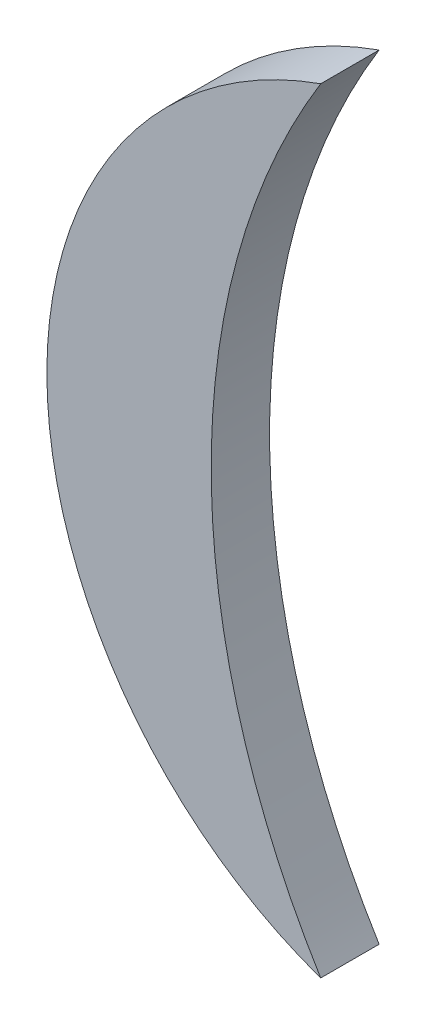
ISO-10303-21;
HEADER;
FILE_DESCRIPTION(('STEP AP214'),'2;1');
FILE_NAME('part.step','',(''),(''),'','','');
FILE_SCHEMA(('AUTOMOTIVE_DESIGN { 1 0 10303 214 1 1 1 1 }'));
ENDSEC;
DATA;
#1=APPLICATION_CONTEXT('core data for automotive mechanical design processes');
#2=APPLICATION_PROTOCOL_DEFINITION('international standard','automotive_design',2000,#1);
#3=PRODUCT_CONTEXT('',#1,'mechanical');
#4=PRODUCT('Part','Part','',(#3));
#5=PRODUCT_RELATED_PRODUCT_CATEGORY('part','',(#4));
#6=PRODUCT_DEFINITION_FORMATION('','',#4);
#7=PRODUCT_DEFINITION_CONTEXT('part definition',#1,'design');
#8=PRODUCT_DEFINITION('design','',#6,#7);
#9=PRODUCT_DEFINITION_SHAPE('','',#8);
#10=(LENGTH_UNIT() NAMED_UNIT(*) SI_UNIT(.MILLI.,.METRE.));
#11=(NAMED_UNIT(*) PLANE_ANGLE_UNIT() SI_UNIT($,.RADIAN.));
#12=(NAMED_UNIT(*) SI_UNIT($,.STERADIAN.) SOLID_ANGLE_UNIT());
#13=UNCERTAINTY_MEASURE_WITH_UNIT(LENGTH_MEASURE(1.E-05),#10,'distance_accuracy_value','');
#14=(GEOMETRIC_REPRESENTATION_CONTEXT(3) GLOBAL_UNCERTAINTY_ASSIGNED_CONTEXT((#13)) GLOBAL_UNIT_ASSIGNED_CONTEXT((#10,
#11,#12)) REPRESENTATION_CONTEXT('',''));
#15=CARTESIAN_POINT('',(0.,0.,0.));
#16=DIRECTION('',(0.,0.,1.));
#17=DIRECTION('',(1.,0.,0.));
#18=AXIS2_PLACEMENT_3D('',#15,#16,#17);
#19=CARTESIAN_POINT('',(117.2000196,54.9999916,0.));
#20=DIRECTION('',(0.,0.,-1.));
#21=DIRECTION('',(1.,0.,0.));
#22=AXIS2_PLACEMENT_3D('',#19,#20,#21);
#23=CYLINDRICAL_SURFACE('',#22,0.4499991);
#24=DIRECTION('',(0.,0.,1.));
#25=VECTOR('',#24,1.);
#26=CARTESIAN_POINT('',(116.816689855288,55.2356979784029,0.));
#27=LINE('',#26,#25);
#28=CARTESIAN_POINT('',(116.816689855288,55.2356979784029,0.));
#29=VERTEX_POINT('',#28);
#30=CARTESIAN_POINT('',(116.816689855288,55.2356979784029,0.03556));
#31=VERTEX_POINT('',#30);
#32=EDGE_CURVE('E11',#29,#31,#27,.T.);
#33=ORIENTED_EDGE('',*,*,#32,.T.);
#34=CARTESIAN_POINT('',(117.2000196,54.9999916,0.03556));
#35=DIRECTION('',(0.,0.,1.));
#36=DIRECTION('',(1.,0.,0.));
#37=AXIS2_PLACEMENT_3D('',#34,#35,#36);
#38=CIRCLE('',#37,0.4499991);
#39=CARTESIAN_POINT('',(116.816689855288,54.7642852215971,0.03556));
#40=VERTEX_POINT('',#39);
#41=EDGE_CURVE('E24',#31,#40,#38,.T.);
#42=ORIENTED_EDGE('',*,*,#41,.T.);
#43=DIRECTION('',(0.,0.,1.));
#44=VECTOR('',#43,1.);
#45=CARTESIAN_POINT('',(116.816689855288,54.7642852215971,0.));
#46=LINE('',#45,#44);
#47=CARTESIAN_POINT('',(116.816689855288,54.7642852215971,0.));
#48=VERTEX_POINT('',#47);
#49=EDGE_CURVE('E40',#48,#40,#46,.T.);
#50=ORIENTED_EDGE('',*,*,#49,.F.);
#51=CARTESIAN_POINT('',(117.2000196,54.9999916,0.));
#52=DIRECTION('',(0.,0.,1.));
#53=DIRECTION('',(1.,0.,0.));
#54=AXIS2_PLACEMENT_3D('',#51,#52,#53);
#55=CIRCLE('',#54,0.4499991);
#56=EDGE_CURVE('E42',#29,#48,#55,.T.);
#57=ORIENTED_EDGE('',*,*,#56,.F.);
#58=EDGE_LOOP('',(#33,#42,#50,#57));
#59=FACE_BOUND('',#58,.T.);
#60=ADVANCED_FACE('F17',(#59),#23,.F.);
#61=CARTESIAN_POINT('',(116.90001004,54.9999916,0.));
#62=DIRECTION('',(0.,0.,-1.));
#63=DIRECTION('',(0.,1.,0.));
#64=AXIS2_PLACEMENT_3D('',#61,#62,#63);
#65=CYLINDRICAL_SURFACE('',#64,0.249999499999994);
#66=CARTESIAN_POINT('',(116.90001004,54.9999916,0.03556));
#67=DIRECTION('',(0.,0.,1.));
#68=DIRECTION('',(0.,1.,0.));
#69=AXIS2_PLACEMENT_3D('',#66,#67,#68);
#70=CIRCLE('',#69,0.249999499999994);
#71=EDGE_CURVE('E49',#31,#40,#70,.T.);
#72=ORIENTED_EDGE('',*,*,#71,.F.);
#73=ORIENTED_EDGE('',*,*,#32,.F.);
#74=CARTESIAN_POINT('',(116.90001004,54.9999916,0.));
#75=DIRECTION('',(0.,0.,1.));
#76=DIRECTION('',(0.,1.,0.));
#77=AXIS2_PLACEMENT_3D('',#74,#75,#76);
#78=CIRCLE('',#77,0.249999499999994);
#79=EDGE_CURVE('E48',#29,#48,#78,.T.);
#80=ORIENTED_EDGE('',*,*,#79,.T.);
#81=ORIENTED_EDGE('',*,*,#49,.T.);
#82=EDGE_LOOP('',(#72,#73,#80,#81));
#83=FACE_BOUND('',#82,.T.);
#84=ADVANCED_FACE('F51',(#83),#65,.T.);
#85=CARTESIAN_POINT('',(116.90001004,54.7499921,0.));
#86=DIRECTION('',(0.,0.,-1.));
#87=DIRECTION('',(-1.,0.,0.));
#88=AXIS2_PLACEMENT_3D('',#85,#86,#87);
#89=PLANE('',#88);
#90=ORIENTED_EDGE('',*,*,#56,.T.);
#91=ORIENTED_EDGE('',*,*,#79,.F.);
#92=EDGE_LOOP('',(#90,#91));
#93=FACE_BOUND('',#92,.T.);
#94=ADVANCED_FACE('F47',(#93),#89,.T.);
#95=CARTESIAN_POINT('',(116.90001004,54.7499921,0.03556));
#96=DIRECTION('',(0.,0.,-1.));
#97=DIRECTION('',(-1.,0.,0.));
#98=AXIS2_PLACEMENT_3D('',#95,#96,#97);
#99=PLANE('',#98);
#100=ORIENTED_EDGE('',*,*,#71,.T.);
#101=ORIENTED_EDGE('',*,*,#41,.F.);
#102=EDGE_LOOP('',(#100,#101));
#103=FACE_BOUND('',#102,.T.);
#104=ADVANCED_FACE('F55',(#103),#99,.F.);
#105=CLOSED_SHELL('',(#60,#84,#94,#104));
#106=MANIFOLD_SOLID_BREP('B1',#105);
#107=ADVANCED_BREP_SHAPE_REPRESENTATION('',(#18,#106),#14);
#108=SHAPE_DEFINITION_REPRESENTATION(#9,#107);
ENDSEC;
END-ISO-10303-21;
